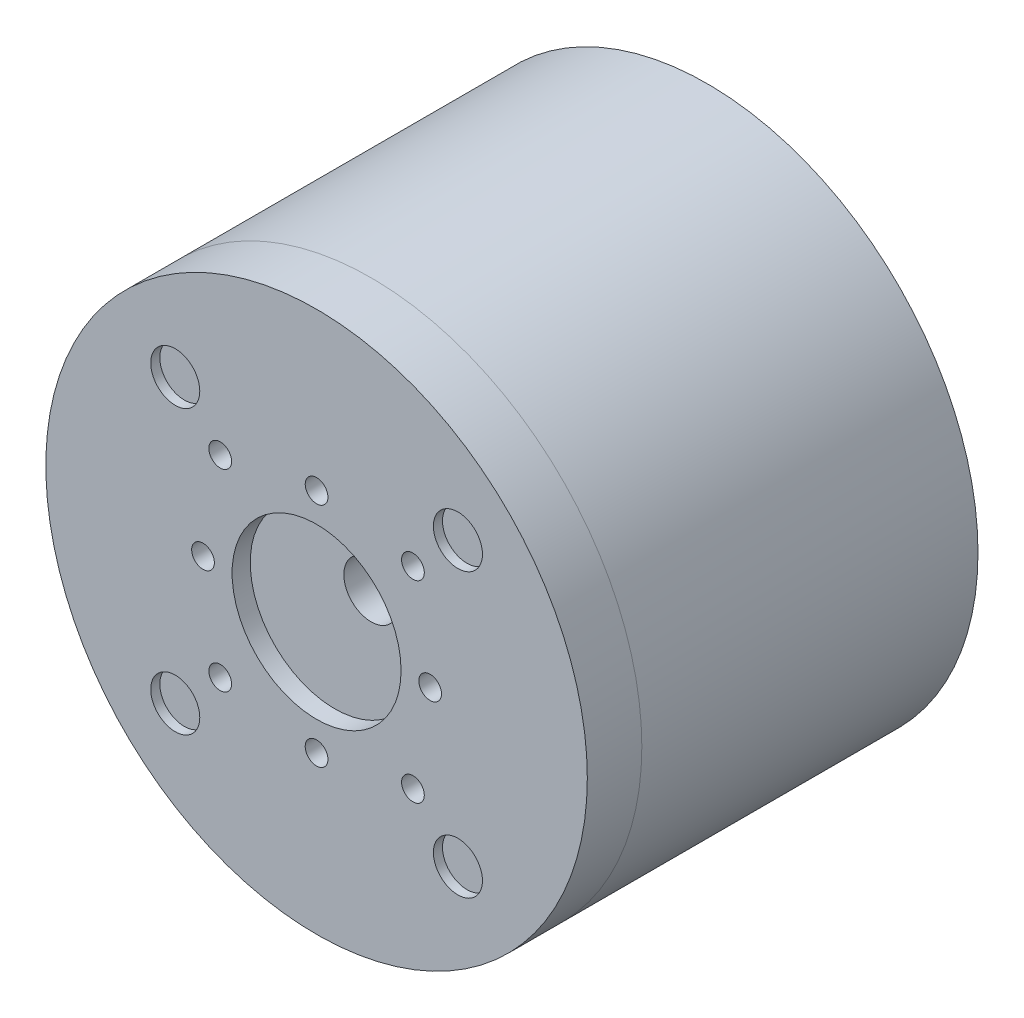
ISO-10303-21;
HEADER;
FILE_DESCRIPTION(('STEP AP214'),'2;1');
FILE_NAME('part.step','',(''),(''),'','','');
FILE_SCHEMA(('AUTOMOTIVE_DESIGN { 1 0 10303 214 1 1 1 1 }'));
ENDSEC;
DATA;
#1=APPLICATION_CONTEXT('core data for automotive mechanical design processes');
#2=APPLICATION_PROTOCOL_DEFINITION('international standard','automotive_design',2000,#1);
#3=PRODUCT_CONTEXT('',#1,'mechanical');
#4=PRODUCT('Part','Part','',(#3));
#5=PRODUCT_RELATED_PRODUCT_CATEGORY('part','',(#4));
#6=PRODUCT_DEFINITION_FORMATION('','',#4);
#7=PRODUCT_DEFINITION_CONTEXT('part definition',#1,'design');
#8=PRODUCT_DEFINITION('design','',#6,#7);
#9=PRODUCT_DEFINITION_SHAPE('','',#8);
#10=(LENGTH_UNIT() NAMED_UNIT(*) SI_UNIT(.MILLI.,.METRE.));
#11=(NAMED_UNIT(*) PLANE_ANGLE_UNIT() SI_UNIT($,.RADIAN.));
#12=(NAMED_UNIT(*) SI_UNIT($,.STERADIAN.) SOLID_ANGLE_UNIT());
#13=UNCERTAINTY_MEASURE_WITH_UNIT(LENGTH_MEASURE(1.E-05),#10,'distance_accuracy_value','');
#14=(GEOMETRIC_REPRESENTATION_CONTEXT(3) GLOBAL_UNCERTAINTY_ASSIGNED_CONTEXT((#13)) GLOBAL_UNIT_ASSIGNED_CONTEXT((#10,
#11,#12)) REPRESENTATION_CONTEXT('',''));
#15=CARTESIAN_POINT('',(0.,0.,0.));
#16=DIRECTION('',(0.,0.,1.));
#17=DIRECTION('',(1.,0.,0.));
#18=AXIS2_PLACEMENT_3D('',#15,#16,#17);
#19=CARTESIAN_POINT('',(0.,0.,43.));
#20=DIRECTION('',(0.,0.,-1.));
#21=DIRECTION('',(-1.,0.,0.));
#22=AXIS2_PLACEMENT_3D('',#19,#20,#21);
#23=CYLINDRICAL_SURFACE('',#22,27.8);
#24=CARTESIAN_POINT('',(0.,0.,37.));
#25=DIRECTION('',(0.,0.,1.));
#26=DIRECTION('',(1.,0.,0.));
#27=AXIS2_PLACEMENT_3D('',#24,#25,#26);
#28=CIRCLE('',#27,27.8);
#29=CARTESIAN_POINT('',(27.8,0.,37.));
#30=VERTEX_POINT('',#29);
#31=EDGE_CURVE('E58',#30,#30,#28,.T.);
#32=ORIENTED_EDGE('',*,*,#31,.F.);
#33=EDGE_LOOP('',(#32));
#34=FACE_BOUND('',#33,.T.);
#35=CARTESIAN_POINT('',(0.,0.,41.));
#36=DIRECTION('',(0.,0.,1.));
#37=DIRECTION('',(1.,0.,0.));
#38=AXIS2_PLACEMENT_3D('',#35,#36,#37);
#39=CIRCLE('',#38,27.8);
#40=CARTESIAN_POINT('',(27.8,0.,41.));
#41=VERTEX_POINT('',#40);
#42=EDGE_CURVE('E62',#41,#41,#39,.T.);
#43=ORIENTED_EDGE('',*,*,#42,.T.);
#44=EDGE_LOOP('',(#43));
#45=FACE_BOUND('',#44,.T.);
#46=ADVANCED_FACE('F47',(#34,#45),#23,.F.);
#47=CARTESIAN_POINT('',(0.,0.,43.));
#48=DIRECTION('',(0.,0.,1.));
#49=DIRECTION('',(1.,0.,0.));
#50=AXIS2_PLACEMENT_3D('',#47,#48,#49);
#51=PLANE('',#50);
#52=CARTESIAN_POINT('',(15.556349186104,-15.556349186104,43.));
#53=DIRECTION('',(0.,0.,1.));
#54=DIRECTION('',(1.,0.,0.));
#55=AXIS2_PLACEMENT_3D('',#52,#53,#54);
#56=CIRCLE('',#55,2.69999999999999);
#57=CARTESIAN_POINT('',(18.256349186104,-15.556349186104,43.));
#58=VERTEX_POINT('',#57);
#59=EDGE_CURVE('E126',#58,#58,#56,.T.);
#60=ORIENTED_EDGE('',*,*,#59,.F.);
#61=EDGE_LOOP('',(#60));
#62=FACE_BOUND('',#61,.T.);
#63=CARTESIAN_POINT('',(-15.556349186104,-15.556349186104,43.));
#64=DIRECTION('',(0.,0.,1.));
#65=DIRECTION('',(1.,0.,0.));
#66=AXIS2_PLACEMENT_3D('',#63,#64,#65);
#67=CIRCLE('',#66,2.69999999999999);
#68=CARTESIAN_POINT('',(-12.856349186104,-15.556349186104,43.));
#69=VERTEX_POINT('',#68);
#70=EDGE_CURVE('E132',#69,#69,#67,.T.);
#71=ORIENTED_EDGE('',*,*,#70,.F.);
#72=EDGE_LOOP('',(#71));
#73=FACE_BOUND('',#72,.T.);
#74=CARTESIAN_POINT('',(-15.556349186104,15.556349186104,43.));
#75=DIRECTION('',(0.,0.,1.));
#76=DIRECTION('',(1.,0.,0.));
#77=AXIS2_PLACEMENT_3D('',#74,#75,#76);
#78=CIRCLE('',#77,2.7);
#79=CARTESIAN_POINT('',(-12.856349186104,15.556349186104,43.));
#80=VERTEX_POINT('',#79);
#81=EDGE_CURVE('E138',#80,#80,#78,.T.);
#82=ORIENTED_EDGE('',*,*,#81,.F.);
#83=EDGE_LOOP('',(#82));
#84=FACE_BOUND('',#83,.T.);
#85=CARTESIAN_POINT('',(15.556349186104,15.556349186104,43.));
#86=DIRECTION('',(0.,0.,1.));
#87=DIRECTION('',(1.,0.,0.));
#88=AXIS2_PLACEMENT_3D('',#85,#86,#87);
#89=CIRCLE('',#88,2.7);
#90=CARTESIAN_POINT('',(18.256349186104,15.556349186104,43.));
#91=VERTEX_POINT('',#90);
#92=EDGE_CURVE('E106',#91,#91,#89,.T.);
#93=ORIENTED_EDGE('',*,*,#92,.F.);
#94=EDGE_LOOP('',(#93));
#95=FACE_BOUND('',#94,.T.);
#96=CARTESIAN_POINT('',(10.6066017177982,-10.6066017177982,43.));
#97=DIRECTION('',(0.,0.,1.));
#98=DIRECTION('',(1.,0.,0.));
#99=AXIS2_PLACEMENT_3D('',#96,#97,#98);
#100=CIRCLE('',#99,1.25);
#101=CARTESIAN_POINT('',(11.8566017177982,-10.6066017177982,43.));
#102=VERTEX_POINT('',#101);
#103=EDGE_CURVE('E102',#102,#102,#100,.T.);
#104=ORIENTED_EDGE('',*,*,#103,.F.);
#105=EDGE_LOOP('',(#104));
#106=FACE_BOUND('',#105,.T.);
#107=CARTESIAN_POINT('',(-10.6066017177982,-10.6066017177982,43.));
#108=DIRECTION('',(0.,0.,1.));
#109=DIRECTION('',(1.,0.,0.));
#110=AXIS2_PLACEMENT_3D('',#107,#108,#109);
#111=CIRCLE('',#110,1.25);
#112=CARTESIAN_POINT('',(-9.35660171779822,-10.6066017177982,43.));
#113=VERTEX_POINT('',#112);
#114=EDGE_CURVE('E109',#113,#113,#111,.T.);
#115=ORIENTED_EDGE('',*,*,#114,.F.);
#116=EDGE_LOOP('',(#115));
#117=FACE_BOUND('',#116,.T.);
#118=CARTESIAN_POINT('',(-10.6066017177982,10.6066017177982,43.));
#119=DIRECTION('',(0.,0.,1.));
#120=DIRECTION('',(1.,0.,0.));
#121=AXIS2_PLACEMENT_3D('',#118,#119,#120);
#122=CIRCLE('',#121,1.25);
#123=CARTESIAN_POINT('',(-9.35660171779821,10.6066017177982,43.));
#124=VERTEX_POINT('',#123);
#125=EDGE_CURVE('E115',#124,#124,#122,.T.);
#126=ORIENTED_EDGE('',*,*,#125,.F.);
#127=EDGE_LOOP('',(#126));
#128=FACE_BOUND('',#127,.T.);
#129=CARTESIAN_POINT('',(10.6066017177982,10.6066017177982,43.));
#130=DIRECTION('',(0.,0.,1.));
#131=DIRECTION('',(1.,0.,0.));
#132=AXIS2_PLACEMENT_3D('',#129,#130,#131);
#133=CIRCLE('',#132,1.25);
#134=CARTESIAN_POINT('',(11.8566017177982,10.6066017177982,43.));
#135=VERTEX_POINT('',#134);
#136=EDGE_CURVE('E76',#135,#135,#133,.T.);
#137=ORIENTED_EDGE('',*,*,#136,.F.);
#138=EDGE_LOOP('',(#137));
#139=FACE_BOUND('',#138,.T.);
#140=CARTESIAN_POINT('',(12.5,0.,43.));
#141=DIRECTION('',(0.,0.,1.));
#142=DIRECTION('',(1.,0.,0.));
#143=AXIS2_PLACEMENT_3D('',#140,#141,#142);
#144=CIRCLE('',#143,1.25);
#145=CARTESIAN_POINT('',(13.75,0.,43.));
#146=VERTEX_POINT('',#145);
#147=EDGE_CURVE('E69',#146,#146,#144,.T.);
#148=ORIENTED_EDGE('',*,*,#147,.F.);
#149=EDGE_LOOP('',(#148));
#150=FACE_BOUND('',#149,.T.);
#151=CARTESIAN_POINT('',(0.,12.5,43.));
#152=DIRECTION('',(0.,0.,1.));
#153=DIRECTION('',(1.,0.,0.));
#154=AXIS2_PLACEMENT_3D('',#151,#152,#153);
#155=CIRCLE('',#154,1.25);
#156=CARTESIAN_POINT('',(1.25,12.5,43.));
#157=VERTEX_POINT('',#156);
#158=EDGE_CURVE('E85',#157,#157,#155,.T.);
#159=ORIENTED_EDGE('',*,*,#158,.F.);
#160=EDGE_LOOP('',(#159));
#161=FACE_BOUND('',#160,.T.);
#162=CARTESIAN_POINT('',(-12.5,0.,43.));
#163=DIRECTION('',(0.,0.,1.));
#164=DIRECTION('',(1.,0.,0.));
#165=AXIS2_PLACEMENT_3D('',#162,#163,#164);
#166=CIRCLE('',#165,1.25);
#167=CARTESIAN_POINT('',(-11.25,0.,43.));
#168=VERTEX_POINT('',#167);
#169=EDGE_CURVE('E79',#168,#168,#166,.T.);
#170=ORIENTED_EDGE('',*,*,#169,.F.);
#171=EDGE_LOOP('',(#170));
#172=FACE_BOUND('',#171,.T.);
#173=CARTESIAN_POINT('',(0.,-12.5,43.));
#174=DIRECTION('',(0.,0.,1.));
#175=DIRECTION('',(1.,0.,0.));
#176=AXIS2_PLACEMENT_3D('',#173,#174,#175);
#177=CIRCLE('',#176,1.25);
#178=CARTESIAN_POINT('',(1.25,-12.5,43.));
#179=VERTEX_POINT('',#178);
#180=EDGE_CURVE('E72',#179,#179,#177,.T.);
#181=ORIENTED_EDGE('',*,*,#180,.F.);
#182=EDGE_LOOP('',(#181));
#183=FACE_BOUND('',#182,.T.);
#184=CARTESIAN_POINT('',(0.,0.,43.));
#185=DIRECTION('',(0.,0.,1.));
#186=DIRECTION('',(1.,0.,0.));
#187=AXIS2_PLACEMENT_3D('',#184,#185,#186);
#188=CIRCLE('',#187,29.8);
#189=CARTESIAN_POINT('',(29.8,0.,43.));
#190=VERTEX_POINT('',#189);
#191=EDGE_CURVE('E11',#190,#190,#188,.T.);
#192=ORIENTED_EDGE('',*,*,#191,.T.);
#193=EDGE_LOOP('',(#192));
#194=FACE_BOUND('',#193,.T.);
#195=CARTESIAN_POINT('',(0.,0.,43.));
#196=DIRECTION('',(0.,0.,1.));
#197=DIRECTION('',(1.,0.,0.));
#198=AXIS2_PLACEMENT_3D('',#195,#196,#197);
#199=CIRCLE('',#198,9.3);
#200=CARTESIAN_POINT('',(9.3,0.,43.));
#201=VERTEX_POINT('',#200);
#202=EDGE_CURVE('E65',#201,#201,#199,.T.);
#203=ORIENTED_EDGE('',*,*,#202,.F.);
#204=EDGE_LOOP('',(#203));
#205=FACE_BOUND('',#204,.T.);
#206=ADVANCED_FACE('F161',(#62,#73,#84,#95,#106,#117,#128,#139,#150,#161,#172,#183,#194,#205),
#51,.T.);
#207=CARTESIAN_POINT('',(0.,0.,37.));
#208=DIRECTION('',(0.,0.,1.));
#209=DIRECTION('',(1.,0.,0.));
#210=AXIS2_PLACEMENT_3D('',#207,#208,#209);
#211=PLANE('',#210);
#212=CARTESIAN_POINT('',(0.,0.,37.));
#213=DIRECTION('',(0.,0.,1.));
#214=DIRECTION('',(1.,0.,0.));
#215=AXIS2_PLACEMENT_3D('',#212,#213,#214);
#216=CIRCLE('',#215,29.8);
#217=CARTESIAN_POINT('',(29.8,0.,37.));
#218=VERTEX_POINT('',#217);
#219=EDGE_CURVE('E51',#218,#218,#216,.T.);
#220=ORIENTED_EDGE('',*,*,#219,.F.);
#221=EDGE_LOOP('',(#220));
#222=FACE_BOUND('',#221,.T.);
#223=ORIENTED_EDGE('',*,*,#31,.T.);
#224=EDGE_LOOP('',(#223));
#225=FACE_BOUND('',#224,.T.);
#226=ADVANCED_FACE('F169',(#222,#225),#211,.F.);
#227=CARTESIAN_POINT('',(0.,0.,43.));
#228=DIRECTION('',(0.,0.,-1.));
#229=DIRECTION('',(-1.,0.,0.));
#230=AXIS2_PLACEMENT_3D('',#227,#228,#229);
#231=CYLINDRICAL_SURFACE('',#230,29.8);
#232=ORIENTED_EDGE('',*,*,#191,.F.);
#233=EDGE_LOOP('',(#232));
#234=FACE_BOUND('',#233,.T.);
#235=ORIENTED_EDGE('',*,*,#219,.T.);
#236=EDGE_LOOP('',(#235));
#237=FACE_BOUND('',#236,.T.);
#238=ADVANCED_FACE('F49',(#234,#237),#231,.T.);
#239=CARTESIAN_POINT('',(0.,0.,41.));
#240=DIRECTION('',(0.,0.,1.));
#241=DIRECTION('',(1.,0.,0.));
#242=AXIS2_PLACEMENT_3D('',#239,#240,#241);
#243=PLANE('',#242);
#244=CARTESIAN_POINT('',(10.6066017177982,-10.6066017177982,41.));
#245=DIRECTION('',(0.,0.,1.));
#246=DIRECTION('',(1.,0.,0.));
#247=AXIS2_PLACEMENT_3D('',#244,#245,#246);
#248=CIRCLE('',#247,1.25);
#249=CARTESIAN_POINT('',(11.8566017177982,-10.6066017177982,41.));
#250=VERTEX_POINT('',#249);
#251=EDGE_CURVE('E105',#250,#250,#248,.T.);
#252=ORIENTED_EDGE('',*,*,#251,.T.);
#253=EDGE_LOOP('',(#252));
#254=FACE_BOUND('',#253,.T.);
#255=CARTESIAN_POINT('',(-10.6066017177982,-10.6066017177982,41.));
#256=DIRECTION('',(0.,0.,1.));
#257=DIRECTION('',(1.,0.,0.));
#258=AXIS2_PLACEMENT_3D('',#255,#256,#257);
#259=CIRCLE('',#258,1.25);
#260=CARTESIAN_POINT('',(-9.35660171779822,-10.6066017177982,41.));
#261=VERTEX_POINT('',#260);
#262=EDGE_CURVE('E112',#261,#261,#259,.T.);
#263=ORIENTED_EDGE('',*,*,#262,.T.);
#264=EDGE_LOOP('',(#263));
#265=FACE_BOUND('',#264,.T.);
#266=CARTESIAN_POINT('',(-10.6066017177982,10.6066017177982,41.));
#267=DIRECTION('',(0.,0.,1.));
#268=DIRECTION('',(1.,0.,0.));
#269=AXIS2_PLACEMENT_3D('',#266,#267,#268);
#270=CIRCLE('',#269,1.25);
#271=CARTESIAN_POINT('',(-9.35660171779821,10.6066017177982,41.));
#272=VERTEX_POINT('',#271);
#273=EDGE_CURVE('E99',#272,#272,#270,.T.);
#274=ORIENTED_EDGE('',*,*,#273,.T.);
#275=EDGE_LOOP('',(#274));
#276=FACE_BOUND('',#275,.T.);
#277=CARTESIAN_POINT('',(10.6066017177982,10.6066017177982,41.));
#278=DIRECTION('',(0.,0.,1.));
#279=DIRECTION('',(1.,0.,0.));
#280=AXIS2_PLACEMENT_3D('',#277,#278,#279);
#281=CIRCLE('',#280,1.25);
#282=CARTESIAN_POINT('',(11.8566017177982,10.6066017177982,41.));
#283=VERTEX_POINT('',#282);
#284=EDGE_CURVE('E96',#283,#283,#281,.T.);
#285=ORIENTED_EDGE('',*,*,#284,.T.);
#286=EDGE_LOOP('',(#285));
#287=FACE_BOUND('',#286,.T.);
#288=CARTESIAN_POINT('',(12.5,0.,41.));
#289=DIRECTION('',(0.,0.,1.));
#290=DIRECTION('',(1.,0.,0.));
#291=AXIS2_PLACEMENT_3D('',#288,#289,#290);
#292=CIRCLE('',#291,1.25);
#293=CARTESIAN_POINT('',(13.75,0.,41.));
#294=VERTEX_POINT('',#293);
#295=EDGE_CURVE('E91',#294,#294,#292,.T.);
#296=ORIENTED_EDGE('',*,*,#295,.T.);
#297=EDGE_LOOP('',(#296));
#298=FACE_BOUND('',#297,.T.);
#299=CARTESIAN_POINT('',(0.,12.5,41.));
#300=DIRECTION('',(0.,0.,1.));
#301=DIRECTION('',(1.,0.,0.));
#302=AXIS2_PLACEMENT_3D('',#299,#300,#301);
#303=CIRCLE('',#302,1.25);
#304=CARTESIAN_POINT('',(1.25,12.5,41.));
#305=VERTEX_POINT('',#304);
#306=EDGE_CURVE('E88',#305,#305,#303,.T.);
#307=ORIENTED_EDGE('',*,*,#306,.T.);
#308=EDGE_LOOP('',(#307));
#309=FACE_BOUND('',#308,.T.);
#310=CARTESIAN_POINT('',(-12.5,0.,41.));
#311=DIRECTION('',(0.,0.,1.));
#312=DIRECTION('',(1.,0.,0.));
#313=AXIS2_PLACEMENT_3D('',#310,#311,#312);
#314=CIRCLE('',#313,1.25);
#315=CARTESIAN_POINT('',(-11.25,0.,41.));
#316=VERTEX_POINT('',#315);
#317=EDGE_CURVE('E82',#316,#316,#314,.T.);
#318=ORIENTED_EDGE('',*,*,#317,.T.);
#319=EDGE_LOOP('',(#318));
#320=FACE_BOUND('',#319,.T.);
#321=CARTESIAN_POINT('',(0.,-12.5,41.));
#322=DIRECTION('',(0.,0.,1.));
#323=DIRECTION('',(1.,0.,0.));
#324=AXIS2_PLACEMENT_3D('',#321,#322,#323);
#325=CIRCLE('',#324,1.25);
#326=CARTESIAN_POINT('',(1.25,-12.5,41.));
#327=VERTEX_POINT('',#326);
#328=EDGE_CURVE('E75',#327,#327,#325,.T.);
#329=ORIENTED_EDGE('',*,*,#328,.T.);
#330=EDGE_LOOP('',(#329));
#331=FACE_BOUND('',#330,.T.);
#332=ORIENTED_EDGE('',*,*,#42,.F.);
#333=EDGE_LOOP('',(#332));
#334=FACE_BOUND('',#333,.T.);
#335=CARTESIAN_POINT('',(0.,0.,41.));
#336=DIRECTION('',(0.,0.,1.));
#337=DIRECTION('',(1.,0.,0.));
#338=AXIS2_PLACEMENT_3D('',#335,#336,#337);
#339=CIRCLE('',#338,9.3);
#340=CARTESIAN_POINT('',(9.3,0.,41.));
#341=VERTEX_POINT('',#340);
#342=EDGE_CURVE('E66',#341,#341,#339,.T.);
#343=ORIENTED_EDGE('',*,*,#342,.T.);
#344=EDGE_LOOP('',(#343));
#345=FACE_BOUND('',#344,.T.);
#346=ADVANCED_FACE('F175',(#254,#265,#276,#287,#298,#309,#320,#331,#334,#345),#243,.F.);
#347=CARTESIAN_POINT('',(0.,0.,43.));
#348=DIRECTION('',(0.,0.,-1.));
#349=DIRECTION('',(-1.,0.,0.));
#350=AXIS2_PLACEMENT_3D('',#347,#348,#349);
#351=CYLINDRICAL_SURFACE('',#350,9.3);
#352=ORIENTED_EDGE('',*,*,#202,.T.);
#353=EDGE_LOOP('',(#352));
#354=FACE_BOUND('',#353,.T.);
#355=ORIENTED_EDGE('',*,*,#342,.F.);
#356=EDGE_LOOP('',(#355));
#357=FACE_BOUND('',#356,.T.);
#358=ADVANCED_FACE('F188',(#354,#357),#351,.F.);
#359=CARTESIAN_POINT('',(0.,-12.5,43.));
#360=DIRECTION('',(0.,0.,-1.));
#361=DIRECTION('',(-1.,0.,0.));
#362=AXIS2_PLACEMENT_3D('',#359,#360,#361);
#363=CYLINDRICAL_SURFACE('',#362,1.25);
#364=ORIENTED_EDGE('',*,*,#180,.T.);
#365=EDGE_LOOP('',(#364));
#366=FACE_BOUND('',#365,.T.);
#367=ORIENTED_EDGE('',*,*,#328,.F.);
#368=EDGE_LOOP('',(#367));
#369=FACE_BOUND('',#368,.T.);
#370=ADVANCED_FACE('F194',(#366,#369),#363,.F.);
#371=CARTESIAN_POINT('',(-12.5,0.,43.));
#372=DIRECTION('',(0.,0.,-1.));
#373=DIRECTION('',(-1.,0.,0.));
#374=AXIS2_PLACEMENT_3D('',#371,#372,#373);
#375=CYLINDRICAL_SURFACE('',#374,1.25);
#376=ORIENTED_EDGE('',*,*,#169,.T.);
#377=EDGE_LOOP('',(#376));
#378=FACE_BOUND('',#377,.T.);
#379=ORIENTED_EDGE('',*,*,#317,.F.);
#380=EDGE_LOOP('',(#379));
#381=FACE_BOUND('',#380,.T.);
#382=ADVANCED_FACE('F218',(#378,#381),#375,.F.);
#383=CARTESIAN_POINT('',(0.,12.5,43.));
#384=DIRECTION('',(0.,0.,-1.));
#385=DIRECTION('',(-1.,0.,0.));
#386=AXIS2_PLACEMENT_3D('',#383,#384,#385);
#387=CYLINDRICAL_SURFACE('',#386,1.25);
#388=ORIENTED_EDGE('',*,*,#158,.T.);
#389=EDGE_LOOP('',(#388));
#390=FACE_BOUND('',#389,.T.);
#391=ORIENTED_EDGE('',*,*,#306,.F.);
#392=EDGE_LOOP('',(#391));
#393=FACE_BOUND('',#392,.T.);
#394=ADVANCED_FACE('F224',(#390,#393),#387,.F.);
#395=CARTESIAN_POINT('',(12.5,0.,43.));
#396=DIRECTION('',(0.,0.,-1.));
#397=DIRECTION('',(-1.,0.,0.));
#398=AXIS2_PLACEMENT_3D('',#395,#396,#397);
#399=CYLINDRICAL_SURFACE('',#398,1.25);
#400=ORIENTED_EDGE('',*,*,#147,.T.);
#401=EDGE_LOOP('',(#400));
#402=FACE_BOUND('',#401,.T.);
#403=ORIENTED_EDGE('',*,*,#295,.F.);
#404=EDGE_LOOP('',(#403));
#405=FACE_BOUND('',#404,.T.);
#406=ADVANCED_FACE('F230',(#402,#405),#399,.F.);
#407=CARTESIAN_POINT('',(10.6066017177982,10.6066017177982,43.));
#408=DIRECTION('',(0.,0.,-1.));
#409=DIRECTION('',(-1.,0.,0.));
#410=AXIS2_PLACEMENT_3D('',#407,#408,#409);
#411=CYLINDRICAL_SURFACE('',#410,1.25);
#412=ORIENTED_EDGE('',*,*,#136,.T.);
#413=EDGE_LOOP('',(#412));
#414=FACE_BOUND('',#413,.T.);
#415=ORIENTED_EDGE('',*,*,#284,.F.);
#416=EDGE_LOOP('',(#415));
#417=FACE_BOUND('',#416,.T.);
#418=ADVANCED_FACE('F233',(#414,#417),#411,.F.);
#419=CARTESIAN_POINT('',(-10.6066017177982,10.6066017177982,43.));
#420=DIRECTION('',(0.,0.,-1.));
#421=DIRECTION('',(-1.,0.,0.));
#422=AXIS2_PLACEMENT_3D('',#419,#420,#421);
#423=CYLINDRICAL_SURFACE('',#422,1.25);
#424=ORIENTED_EDGE('',*,*,#125,.T.);
#425=EDGE_LOOP('',(#424));
#426=FACE_BOUND('',#425,.T.);
#427=ORIENTED_EDGE('',*,*,#273,.F.);
#428=EDGE_LOOP('',(#427));
#429=FACE_BOUND('',#428,.T.);
#430=ADVANCED_FACE('F236',(#426,#429),#423,.F.);
#431=CARTESIAN_POINT('',(-10.6066017177982,-10.6066017177982,43.));
#432=DIRECTION('',(0.,0.,-1.));
#433=DIRECTION('',(-1.,0.,0.));
#434=AXIS2_PLACEMENT_3D('',#431,#432,#433);
#435=CYLINDRICAL_SURFACE('',#434,1.25);
#436=ORIENTED_EDGE('',*,*,#114,.T.);
#437=EDGE_LOOP('',(#436));
#438=FACE_BOUND('',#437,.T.);
#439=ORIENTED_EDGE('',*,*,#262,.F.);
#440=EDGE_LOOP('',(#439));
#441=FACE_BOUND('',#440,.T.);
#442=ADVANCED_FACE('F241',(#438,#441),#435,.F.);
#443=CARTESIAN_POINT('',(10.6066017177982,-10.6066017177982,43.));
#444=DIRECTION('',(0.,0.,-1.));
#445=DIRECTION('',(-1.,0.,0.));
#446=AXIS2_PLACEMENT_3D('',#443,#444,#445);
#447=CYLINDRICAL_SURFACE('',#446,1.25);
#448=ORIENTED_EDGE('',*,*,#103,.T.);
#449=EDGE_LOOP('',(#448));
#450=FACE_BOUND('',#449,.T.);
#451=ORIENTED_EDGE('',*,*,#251,.F.);
#452=EDGE_LOOP('',(#451));
#453=FACE_BOUND('',#452,.T.);
#454=ADVANCED_FACE('F238',(#450,#453),#447,.F.);
#455=CARTESIAN_POINT('',(15.556349186104,15.556349186104,43.));
#456=DIRECTION('',(0.,0.,-1.));
#457=DIRECTION('',(-1.,0.,0.));
#458=AXIS2_PLACEMENT_3D('',#455,#456,#457);
#459=CYLINDRICAL_SURFACE('',#458,2.7);
#460=ORIENTED_EDGE('',*,*,#92,.T.);
#461=EDGE_LOOP('',(#460));
#462=FACE_BOUND('',#461,.T.);
#463=CARTESIAN_POINT('',(15.556349186104,15.556349186104,42.));
#464=DIRECTION('',(0.,0.,1.));
#465=DIRECTION('',(1.,0.,0.));
#466=AXIS2_PLACEMENT_3D('',#463,#464,#465);
#467=CIRCLE('',#466,2.7);
#468=CARTESIAN_POINT('',(18.256349186104,15.556349186104,42.));
#469=VERTEX_POINT('',#468);
#470=EDGE_CURVE('E120',#469,#469,#467,.T.);
#471=ORIENTED_EDGE('',*,*,#470,.F.);
#472=EDGE_LOOP('',(#471));
#473=FACE_BOUND('',#472,.T.);
#474=ADVANCED_FACE('F157',(#462,#473),#459,.F.);
#475=CARTESIAN_POINT('',(15.556349186104,15.556349186104,42.));
#476=DIRECTION('',(0.,0.,1.));
#477=DIRECTION('',(1.,0.,0.));
#478=AXIS2_PLACEMENT_3D('',#475,#476,#477);
#479=PLANE('',#478);
#480=ORIENTED_EDGE('',*,*,#470,.T.);
#481=EDGE_LOOP('',(#480));
#482=FACE_BOUND('',#481,.T.);
#483=ADVANCED_FACE('F148',(#482),#479,.T.);
#484=CARTESIAN_POINT('',(-15.556349186104,15.556349186104,43.));
#485=DIRECTION('',(0.,0.,-1.));
#486=DIRECTION('',(-1.,0.,0.));
#487=AXIS2_PLACEMENT_3D('',#484,#485,#486);
#488=CYLINDRICAL_SURFACE('',#487,2.7);
#489=ORIENTED_EDGE('',*,*,#81,.T.);
#490=EDGE_LOOP('',(#489));
#491=FACE_BOUND('',#490,.T.);
#492=CARTESIAN_POINT('',(-15.556349186104,15.556349186104,42.));
#493=DIRECTION('',(0.,0.,1.));
#494=DIRECTION('',(1.,0.,0.));
#495=AXIS2_PLACEMENT_3D('',#492,#493,#494);
#496=CIRCLE('',#495,2.7);
#497=CARTESIAN_POINT('',(-12.856349186104,15.556349186104,42.));
#498=VERTEX_POINT('',#497);
#499=EDGE_CURVE('E123',#498,#498,#496,.T.);
#500=ORIENTED_EDGE('',*,*,#499,.F.);
#501=EDGE_LOOP('',(#500));
#502=FACE_BOUND('',#501,.T.);
#503=ADVANCED_FACE('F146',(#491,#502),#488,.F.);
#504=CARTESIAN_POINT('',(-15.556349186104,15.556349186104,42.));
#505=DIRECTION('',(0.,0.,1.));
#506=DIRECTION('',(1.,0.,0.));
#507=AXIS2_PLACEMENT_3D('',#504,#505,#506);
#508=PLANE('',#507);
#509=ORIENTED_EDGE('',*,*,#499,.T.);
#510=EDGE_LOOP('',(#509));
#511=FACE_BOUND('',#510,.T.);
#512=ADVANCED_FACE('F144',(#511),#508,.T.);
#513=CARTESIAN_POINT('',(-15.556349186104,-15.556349186104,43.));
#514=DIRECTION('',(0.,0.,-1.));
#515=DIRECTION('',(-1.,0.,0.));
#516=AXIS2_PLACEMENT_3D('',#513,#514,#515);
#517=CYLINDRICAL_SURFACE('',#516,2.69999999999999);
#518=ORIENTED_EDGE('',*,*,#70,.T.);
#519=EDGE_LOOP('',(#518));
#520=FACE_BOUND('',#519,.T.);
#521=CARTESIAN_POINT('',(-15.556349186104,-15.556349186104,42.));
#522=DIRECTION('',(0.,0.,1.));
#523=DIRECTION('',(1.,0.,0.));
#524=AXIS2_PLACEMENT_3D('',#521,#522,#523);
#525=CIRCLE('',#524,2.69999999999999);
#526=CARTESIAN_POINT('',(-12.856349186104,-15.556349186104,42.));
#527=VERTEX_POINT('',#526);
#528=EDGE_CURVE('E135',#527,#527,#525,.T.);
#529=ORIENTED_EDGE('',*,*,#528,.F.);
#530=EDGE_LOOP('',(#529));
#531=FACE_BOUND('',#530,.T.);
#532=ADVANCED_FACE('F155',(#520,#531),#517,.F.);
#533=CARTESIAN_POINT('',(-15.556349186104,-15.556349186104,42.));
#534=DIRECTION('',(0.,0.,1.));
#535=DIRECTION('',(1.,0.,0.));
#536=AXIS2_PLACEMENT_3D('',#533,#534,#535);
#537=PLANE('',#536);
#538=ORIENTED_EDGE('',*,*,#528,.T.);
#539=EDGE_LOOP('',(#538));
#540=FACE_BOUND('',#539,.T.);
#541=ADVANCED_FACE('F259',(#540),#537,.T.);
#542=CARTESIAN_POINT('',(15.556349186104,-15.556349186104,43.));
#543=DIRECTION('',(0.,0.,-1.));
#544=DIRECTION('',(-1.,0.,0.));
#545=AXIS2_PLACEMENT_3D('',#542,#543,#544);
#546=CYLINDRICAL_SURFACE('',#545,2.69999999999999);
#547=ORIENTED_EDGE('',*,*,#59,.T.);
#548=EDGE_LOOP('',(#547));
#549=FACE_BOUND('',#548,.T.);
#550=CARTESIAN_POINT('',(15.556349186104,-15.556349186104,42.));
#551=DIRECTION('',(0.,0.,1.));
#552=DIRECTION('',(1.,0.,0.));
#553=AXIS2_PLACEMENT_3D('',#550,#551,#552);
#554=CIRCLE('',#553,2.69999999999999);
#555=CARTESIAN_POINT('',(18.256349186104,-15.556349186104,42.));
#556=VERTEX_POINT('',#555);
#557=EDGE_CURVE('E129',#556,#556,#554,.T.);
#558=ORIENTED_EDGE('',*,*,#557,.F.);
#559=EDGE_LOOP('',(#558));
#560=FACE_BOUND('',#559,.T.);
#561=ADVANCED_FACE('F255',(#549,#560),#546,.F.);
#562=CARTESIAN_POINT('',(15.556349186104,-15.556349186104,42.));
#563=DIRECTION('',(0.,0.,1.));
#564=DIRECTION('',(1.,0.,0.));
#565=AXIS2_PLACEMENT_3D('',#562,#563,#564);
#566=PLANE('',#565);
#567=ORIENTED_EDGE('',*,*,#557,.T.);
#568=EDGE_LOOP('',(#567));
#569=FACE_BOUND('',#568,.T.);
#570=ADVANCED_FACE('F252',(#569),#566,.T.);
#571=CLOSED_SHELL('',(#46,#206,#226,#238,#346,#358,#370,#382,#394,#406,#418,#430,#442,#454,#474,
#483,#503,#512,#532,#541,#561,#570));
#572=MANIFOLD_SOLID_BREP('B2',#571);
#573=CARTESIAN_POINT('',(0.,0.,37.));
#574=DIRECTION('',(0.,0.,1.));
#575=DIRECTION('',(1.,0.,0.));
#576=AXIS2_PLACEMENT_3D('',#573,#574,#575);
#577=PLANE('',#576);
#578=CARTESIAN_POINT('',(0.,0.,37.));
#579=DIRECTION('',(0.,0.,1.));
#580=DIRECTION('',(1.,0.,0.));
#581=AXIS2_PLACEMENT_3D('',#578,#579,#580);
#582=CIRCLE('',#581,29.8);
#583=CARTESIAN_POINT('',(29.8,0.,37.));
#584=VERTEX_POINT('',#583);
#585=EDGE_CURVE('E46',#584,#584,#582,.T.);
#586=ORIENTED_EDGE('',*,*,#585,.T.);
#587=EDGE_LOOP('',(#586));
#588=FACE_BOUND('',#587,.T.);
#589=CARTESIAN_POINT('',(0.,0.,37.));
#590=DIRECTION('',(0.,0.,1.));
#591=DIRECTION('',(1.,0.,0.));
#592=AXIS2_PLACEMENT_3D('',#589,#590,#591);
#593=CIRCLE('',#592,3.);
#594=CARTESIAN_POINT('',(3.,0.,37.));
#595=VERTEX_POINT('',#594);
#596=EDGE_CURVE('E443',#595,#595,#593,.T.);
#597=ORIENTED_EDGE('',*,*,#596,.F.);
#598=EDGE_LOOP('',(#597));
#599=FACE_BOUND('',#598,.T.);
#600=ADVANCED_FACE('F430',(#588,#599),#577,.T.);
#601=CARTESIAN_POINT('',(0.,0.,0.));
#602=DIRECTION('',(0.,0.,1.));
#603=DIRECTION('',(1.,0.,0.));
#604=AXIS2_PLACEMENT_3D('',#601,#602,#603);
#605=PLANE('',#604);
#606=CARTESIAN_POINT('',(8.83883476483185,-8.83883476483185,0.));
#607=DIRECTION('',(0.,0.,1.));
#608=DIRECTION('',(1.,0.,0.));
#609=AXIS2_PLACEMENT_3D('',#606,#607,#608);
#610=CIRCLE('',#609,1.25);
#611=CARTESIAN_POINT('',(10.0888347648318,-8.83883476483185,0.));
#612=VERTEX_POINT('',#611);
#613=EDGE_CURVE('E463',#612,#612,#610,.T.);
#614=ORIENTED_EDGE('',*,*,#613,.T.);
#615=EDGE_LOOP('',(#614));
#616=FACE_BOUND('',#615,.T.);
#617=CARTESIAN_POINT('',(-8.83883476483185,-8.83883476483185,0.));
#618=DIRECTION('',(0.,0.,1.));
#619=DIRECTION('',(1.,0.,0.));
#620=AXIS2_PLACEMENT_3D('',#617,#618,#619);
#621=CIRCLE('',#620,1.25);
#622=CARTESIAN_POINT('',(-7.58883476483185,-8.83883476483185,0.));
#623=VERTEX_POINT('',#622);
#624=EDGE_CURVE('E469',#623,#623,#621,.T.);
#625=ORIENTED_EDGE('',*,*,#624,.T.);
#626=EDGE_LOOP('',(#625));
#627=FACE_BOUND('',#626,.T.);
#628=CARTESIAN_POINT('',(-8.83883476483185,8.83883476483185,0.));
#629=DIRECTION('',(0.,0.,1.));
#630=DIRECTION('',(1.,0.,0.));
#631=AXIS2_PLACEMENT_3D('',#628,#629,#630);
#632=CIRCLE('',#631,1.25);
#633=CARTESIAN_POINT('',(-7.58883476483184,8.83883476483185,0.));
#634=VERTEX_POINT('',#633);
#635=EDGE_CURVE('E457',#634,#634,#632,.T.);
#636=ORIENTED_EDGE('',*,*,#635,.T.);
#637=EDGE_LOOP('',(#636));
#638=FACE_BOUND('',#637,.T.);
#639=CARTESIAN_POINT('',(8.83883476483185,8.83883476483185,0.));
#640=DIRECTION('',(0.,0.,1.));
#641=DIRECTION('',(1.,0.,0.));
#642=AXIS2_PLACEMENT_3D('',#639,#640,#641);
#643=CIRCLE('',#642,1.25);
#644=CARTESIAN_POINT('',(10.0888347648318,8.83883476483185,0.));
#645=VERTEX_POINT('',#644);
#646=EDGE_CURVE('E454',#645,#645,#643,.T.);
#647=ORIENTED_EDGE('',*,*,#646,.T.);
#648=EDGE_LOOP('',(#647));
#649=FACE_BOUND('',#648,.T.);
#650=CARTESIAN_POINT('',(0.,0.,0.));
#651=DIRECTION('',(0.,0.,1.));
#652=DIRECTION('',(1.,0.,0.));
#653=AXIS2_PLACEMENT_3D('',#650,#651,#652);
#654=CIRCLE('',#653,6.35);
#655=CARTESIAN_POINT('',(6.35,0.,0.));
#656=VERTEX_POINT('',#655);
#657=EDGE_CURVE('E447',#656,#656,#654,.T.);
#658=ORIENTED_EDGE('',*,*,#657,.T.);
#659=EDGE_LOOP('',(#658));
#660=FACE_BOUND('',#659,.T.);
#661=CARTESIAN_POINT('',(0.,0.,0.));
#662=DIRECTION('',(0.,0.,1.));
#663=DIRECTION('',(1.,0.,0.));
#664=AXIS2_PLACEMENT_3D('',#661,#662,#663);
#665=CIRCLE('',#664,29.8);
#666=CARTESIAN_POINT('',(29.8,0.,0.));
#667=VERTEX_POINT('',#666);
#668=EDGE_CURVE('E438',#667,#667,#665,.T.);
#669=ORIENTED_EDGE('',*,*,#668,.F.);
#670=EDGE_LOOP('',(#669));
#671=FACE_BOUND('',#670,.T.);
#672=ADVANCED_FACE('F478',(#616,#627,#638,#649,#660,#671),#605,.F.);
#673=CARTESIAN_POINT('',(0.,0.,37.));
#674=DIRECTION('',(0.,0.,-1.));
#675=DIRECTION('',(-1.,0.,0.));
#676=AXIS2_PLACEMENT_3D('',#673,#674,#675);
#677=CYLINDRICAL_SURFACE('',#676,29.8);
#678=ORIENTED_EDGE('',*,*,#585,.F.);
#679=EDGE_LOOP('',(#678));
#680=FACE_BOUND('',#679,.T.);
#681=ORIENTED_EDGE('',*,*,#668,.T.);
#682=EDGE_LOOP('',(#681));
#683=FACE_BOUND('',#682,.T.);
#684=ADVANCED_FACE('F432',(#680,#683),#677,.T.);
#685=CARTESIAN_POINT('',(0.,0.,37.));
#686=DIRECTION('',(0.,0.,-1.));
#687=DIRECTION('',(-1.,0.,0.));
#688=AXIS2_PLACEMENT_3D('',#685,#686,#687);
#689=CYLINDRICAL_SURFACE('',#688,3.);
#690=CARTESIAN_POINT('',(0.,0.,1.));
#691=DIRECTION('',(0.,0.,1.));
#692=DIRECTION('',(1.,0.,0.));
#693=AXIS2_PLACEMENT_3D('',#690,#691,#692);
#694=CIRCLE('',#693,3.);
#695=CARTESIAN_POINT('',(3.,0.,1.));
#696=VERTEX_POINT('',#695);
#697=EDGE_CURVE('E434',#696,#696,#694,.T.);
#698=ORIENTED_EDGE('',*,*,#697,.F.);
#699=EDGE_LOOP('',(#698));
#700=FACE_BOUND('',#699,.T.);
#701=ORIENTED_EDGE('',*,*,#596,.T.);
#702=EDGE_LOOP('',(#701));
#703=FACE_BOUND('',#702,.T.);
#704=ADVANCED_FACE('F506',(#700,#703),#689,.F.);
#705=CARTESIAN_POINT('',(0.,0.,1.));
#706=DIRECTION('',(0.,0.,-1.));
#707=DIRECTION('',(-1.,0.,0.));
#708=AXIS2_PLACEMENT_3D('',#705,#706,#707);
#709=CYLINDRICAL_SURFACE('',#708,6.35);
#710=CARTESIAN_POINT('',(0.,0.,1.));
#711=DIRECTION('',(0.,0.,1.));
#712=DIRECTION('',(1.,0.,0.));
#713=AXIS2_PLACEMENT_3D('',#710,#711,#712);
#714=CIRCLE('',#713,6.35);
#715=CARTESIAN_POINT('',(6.35,0.,1.));
#716=VERTEX_POINT('',#715);
#717=EDGE_CURVE('E450',#716,#716,#714,.T.);
#718=ORIENTED_EDGE('',*,*,#717,.T.);
#719=EDGE_LOOP('',(#718));
#720=FACE_BOUND('',#719,.T.);
#721=ORIENTED_EDGE('',*,*,#657,.F.);
#722=EDGE_LOOP('',(#721));
#723=FACE_BOUND('',#722,.T.);
#724=ADVANCED_FACE('F509',(#720,#723),#709,.F.);
#725=CARTESIAN_POINT('',(0.,0.,1.));
#726=DIRECTION('',(0.,0.,1.));
#727=DIRECTION('',(1.,0.,0.));
#728=AXIS2_PLACEMENT_3D('',#725,#726,#727);
#729=PLANE('',#728);
#730=ORIENTED_EDGE('',*,*,#697,.T.);
#731=EDGE_LOOP('',(#730));
#732=FACE_BOUND('',#731,.T.);
#733=ORIENTED_EDGE('',*,*,#717,.F.);
#734=EDGE_LOOP('',(#733));
#735=FACE_BOUND('',#734,.T.);
#736=ADVANCED_FACE('F513',(#732,#735),#729,.F.);
#737=CARTESIAN_POINT('',(8.83883476483185,8.83883476483185,5.));
#738=DIRECTION('',(0.,0.,-1.));
#739=DIRECTION('',(-1.,0.,0.));
#740=AXIS2_PLACEMENT_3D('',#737,#738,#739);
#741=CYLINDRICAL_SURFACE('',#740,1.25);
#742=CARTESIAN_POINT('',(8.83883476483185,8.83883476483185,5.));
#743=DIRECTION('',(0.,0.,1.));
#744=DIRECTION('',(1.,0.,0.));
#745=AXIS2_PLACEMENT_3D('',#742,#743,#744);
#746=CIRCLE('',#745,1.25);
#747=CARTESIAN_POINT('',(10.0888347648318,8.83883476483185,5.));
#748=VERTEX_POINT('',#747);
#749=EDGE_CURVE('E451',#748,#748,#746,.T.);
#750=ORIENTED_EDGE('',*,*,#749,.T.);
#751=EDGE_LOOP('',(#750));
#752=FACE_BOUND('',#751,.T.);
#753=ORIENTED_EDGE('',*,*,#646,.F.);
#754=EDGE_LOOP('',(#753));
#755=FACE_BOUND('',#754,.T.);
#756=ADVANCED_FACE('F494',(#752,#755),#741,.F.);
#757=CARTESIAN_POINT('',(8.83883476483185,8.83883476483185,5.));
#758=DIRECTION('',(0.,0.,1.));
#759=DIRECTION('',(1.,0.,0.));
#760=AXIS2_PLACEMENT_3D('',#757,#758,#759);
#761=PLANE('',#760);
#762=ORIENTED_EDGE('',*,*,#749,.F.);
#763=EDGE_LOOP('',(#762));
#764=FACE_BOUND('',#763,.T.);
#765=ADVANCED_FACE('F484',(#764),#761,.F.);
#766=CARTESIAN_POINT('',(-8.83883476483185,8.83883476483185,5.));
#767=DIRECTION('',(0.,0.,-1.));
#768=DIRECTION('',(-1.,0.,0.));
#769=AXIS2_PLACEMENT_3D('',#766,#767,#768);
#770=CYLINDRICAL_SURFACE('',#769,1.25);
#771=CARTESIAN_POINT('',(-8.83883476483185,8.83883476483185,5.));
#772=DIRECTION('',(0.,0.,1.));
#773=DIRECTION('',(1.,0.,0.));
#774=AXIS2_PLACEMENT_3D('',#771,#772,#773);
#775=CIRCLE('',#774,1.25);
#776=CARTESIAN_POINT('',(-7.58883476483184,8.83883476483185,5.));
#777=VERTEX_POINT('',#776);
#778=EDGE_CURVE('E472',#777,#777,#775,.T.);
#779=ORIENTED_EDGE('',*,*,#778,.T.);
#780=EDGE_LOOP('',(#779));
#781=FACE_BOUND('',#780,.T.);
#782=ORIENTED_EDGE('',*,*,#635,.F.);
#783=EDGE_LOOP('',(#782));
#784=FACE_BOUND('',#783,.T.);
#785=ADVANCED_FACE('F481',(#781,#784),#770,.F.);
#786=CARTESIAN_POINT('',(-8.83883476483185,8.83883476483185,5.));
#787=DIRECTION('',(0.,0.,1.));
#788=DIRECTION('',(1.,0.,0.));
#789=AXIS2_PLACEMENT_3D('',#786,#787,#788);
#790=PLANE('',#789);
#791=ORIENTED_EDGE('',*,*,#778,.F.);
#792=EDGE_LOOP('',(#791));
#793=FACE_BOUND('',#792,.T.);
#794=ADVANCED_FACE('F483',(#793),#790,.F.);
#795=CARTESIAN_POINT('',(-8.83883476483185,-8.83883476483185,5.));
#796=DIRECTION('',(0.,0.,-1.));
#797=DIRECTION('',(-1.,0.,0.));
#798=AXIS2_PLACEMENT_3D('',#795,#796,#797);
#799=CYLINDRICAL_SURFACE('',#798,1.25);
#800=CARTESIAN_POINT('',(-8.83883476483185,-8.83883476483185,5.));
#801=DIRECTION('',(0.,0.,1.));
#802=DIRECTION('',(1.,0.,0.));
#803=AXIS2_PLACEMENT_3D('',#800,#801,#802);
#804=CIRCLE('',#803,1.25);
#805=CARTESIAN_POINT('',(-7.58883476483185,-8.83883476483185,5.));
#806=VERTEX_POINT('',#805);
#807=EDGE_CURVE('E466',#806,#806,#804,.T.);
#808=ORIENTED_EDGE('',*,*,#807,.T.);
#809=EDGE_LOOP('',(#808));
#810=FACE_BOUND('',#809,.T.);
#811=ORIENTED_EDGE('',*,*,#624,.F.);
#812=EDGE_LOOP('',(#811));
#813=FACE_BOUND('',#812,.T.);
#814=ADVANCED_FACE('F491',(#810,#813),#799,.F.);
#815=CARTESIAN_POINT('',(-8.83883476483185,-8.83883476483185,5.));
#816=DIRECTION('',(0.,0.,1.));
#817=DIRECTION('',(1.,0.,0.));
#818=AXIS2_PLACEMENT_3D('',#815,#816,#817);
#819=PLANE('',#818);
#820=ORIENTED_EDGE('',*,*,#807,.F.);
#821=EDGE_LOOP('',(#820));
#822=FACE_BOUND('',#821,.T.);
#823=ADVANCED_FACE('F528',(#822),#819,.F.);
#824=CARTESIAN_POINT('',(8.83883476483185,-8.83883476483185,5.));
#825=DIRECTION('',(0.,0.,-1.));
#826=DIRECTION('',(-1.,0.,0.));
#827=AXIS2_PLACEMENT_3D('',#824,#825,#826);
#828=CYLINDRICAL_SURFACE('',#827,1.25);
#829=CARTESIAN_POINT('',(8.83883476483185,-8.83883476483185,5.));
#830=DIRECTION('',(0.,0.,1.));
#831=DIRECTION('',(1.,0.,0.));
#832=AXIS2_PLACEMENT_3D('',#829,#830,#831);
#833=CIRCLE('',#832,1.25);
#834=CARTESIAN_POINT('',(10.0888347648318,-8.83883476483185,5.));
#835=VERTEX_POINT('',#834);
#836=EDGE_CURVE('E460',#835,#835,#833,.T.);
#837=ORIENTED_EDGE('',*,*,#836,.T.);
#838=EDGE_LOOP('',(#837));
#839=FACE_BOUND('',#838,.T.);
#840=ORIENTED_EDGE('',*,*,#613,.F.);
#841=EDGE_LOOP('',(#840));
#842=FACE_BOUND('',#841,.T.);
#843=ADVANCED_FACE('F524',(#839,#842),#828,.F.);
#844=CARTESIAN_POINT('',(8.83883476483185,-8.83883476483185,5.));
#845=DIRECTION('',(0.,0.,1.));
#846=DIRECTION('',(1.,0.,0.));
#847=AXIS2_PLACEMENT_3D('',#844,#845,#846);
#848=PLANE('',#847);
#849=ORIENTED_EDGE('',*,*,#836,.F.);
#850=EDGE_LOOP('',(#849));
#851=FACE_BOUND('',#850,.T.);
#852=ADVANCED_FACE('F521',(#851),#848,.F.);
#853=CLOSED_SHELL('',(#600,#672,#684,#704,#724,#736,#756,#765,#785,#794,#814,#823,#843,#852));
#854=MANIFOLD_SOLID_BREP('B6',#853);
#855=ADVANCED_BREP_SHAPE_REPRESENTATION('',(#18,#572,#854),#14);
#856=SHAPE_DEFINITION_REPRESENTATION(#9,#855);
ENDSEC;
END-ISO-10303-21;
